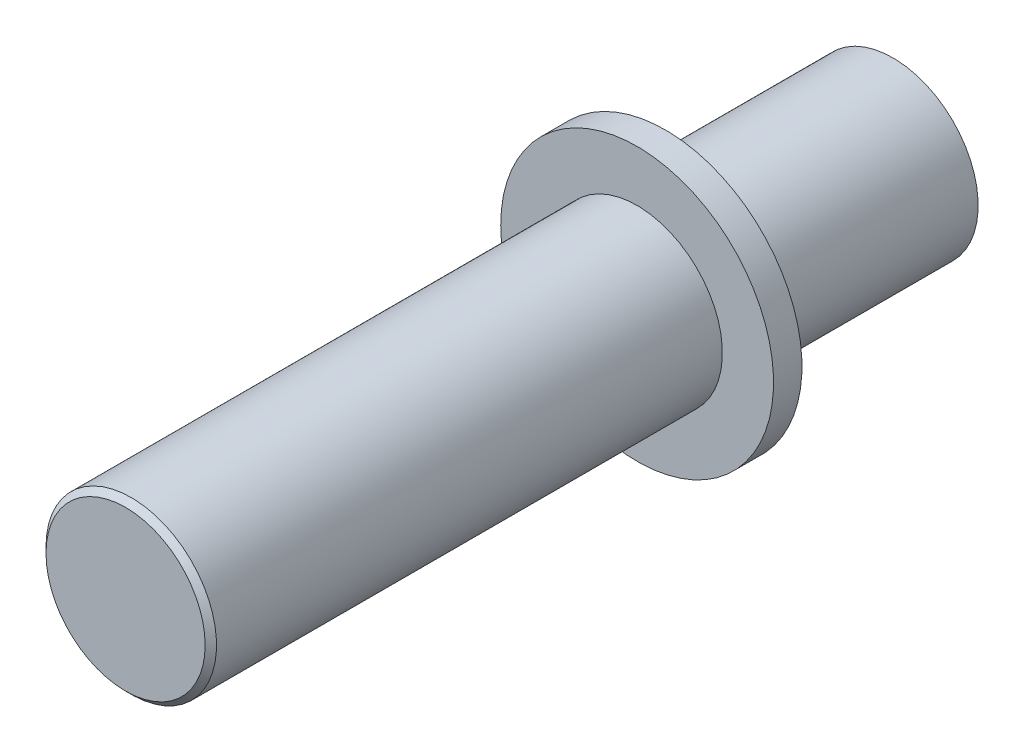
ISO-10303-21;
HEADER;
FILE_DESCRIPTION(('STEP AP214'),'2;1');
FILE_NAME('part.step','',(''),(''),'','','');
FILE_SCHEMA(('AUTOMOTIVE_DESIGN { 1 0 10303 214 1 1 1 1 }'));
ENDSEC;
DATA;
#1=APPLICATION_CONTEXT('core data for automotive mechanical design processes');
#2=APPLICATION_PROTOCOL_DEFINITION('international standard','automotive_design',2000,#1);
#3=PRODUCT_CONTEXT('',#1,'mechanical');
#4=PRODUCT('Part','Part','',(#3));
#5=PRODUCT_RELATED_PRODUCT_CATEGORY('part','',(#4));
#6=PRODUCT_DEFINITION_FORMATION('','',#4);
#7=PRODUCT_DEFINITION_CONTEXT('part definition',#1,'design');
#8=PRODUCT_DEFINITION('design','',#6,#7);
#9=PRODUCT_DEFINITION_SHAPE('','',#8);
#10=(LENGTH_UNIT() NAMED_UNIT(*) SI_UNIT(.MILLI.,.METRE.));
#11=(NAMED_UNIT(*) PLANE_ANGLE_UNIT() SI_UNIT($,.RADIAN.));
#12=(NAMED_UNIT(*) SI_UNIT($,.STERADIAN.) SOLID_ANGLE_UNIT());
#13=UNCERTAINTY_MEASURE_WITH_UNIT(LENGTH_MEASURE(1.E-05),#10,'distance_accuracy_value','');
#14=(GEOMETRIC_REPRESENTATION_CONTEXT(3) GLOBAL_UNCERTAINTY_ASSIGNED_CONTEXT((#13)) GLOBAL_UNIT_ASSIGNED_CONTEXT((#10,
#11,#12)) REPRESENTATION_CONTEXT('',''));
#15=CARTESIAN_POINT('',(0.,0.,0.));
#16=DIRECTION('',(0.,0.,1.));
#17=DIRECTION('',(1.,0.,0.));
#18=AXIS2_PLACEMENT_3D('',#15,#16,#17);
#19=CARTESIAN_POINT('',(0.,0.,-45.));
#20=DIRECTION('',(0.,0.,1.));
#21=DIRECTION('',(1.,0.,0.));
#22=AXIS2_PLACEMENT_3D('',#19,#20,#21);
#23=CYLINDRICAL_SURFACE('',#22,15.);
#24=CARTESIAN_POINT('',(0.,0.,-45.));
#25=DIRECTION('',(0.,0.,-1.));
#26=DIRECTION('',(-1.,0.,0.));
#27=AXIS2_PLACEMENT_3D('',#24,#25,#26);
#28=CIRCLE('',#27,15.);
#29=CARTESIAN_POINT('',(-15.,0.,-45.));
#30=VERTEX_POINT('',#29);
#31=EDGE_CURVE('E100',#30,#30,#28,.T.);
#32=ORIENTED_EDGE('',*,*,#31,.F.);
#33=EDGE_LOOP('',(#32));
#34=FACE_BOUND('',#33,.T.);
#35=CARTESIAN_POINT('',(0.,0.,-5.));
#36=DIRECTION('',(0.,0.,-1.));
#37=DIRECTION('',(-1.,0.,0.));
#38=AXIS2_PLACEMENT_3D('',#35,#36,#37);
#39=CIRCLE('',#38,15.);
#40=CARTESIAN_POINT('',(-15.,0.,-5.));
#41=VERTEX_POINT('',#40);
#42=EDGE_CURVE('E110',#41,#41,#39,.T.);
#43=ORIENTED_EDGE('',*,*,#42,.T.);
#44=EDGE_LOOP('',(#43));
#45=FACE_BOUND('',#44,.T.);
#46=CARTESIAN_POINT('',(-14.6360761339532,3.28409430454217,-35.));
#47=CARTESIAN_POINT('',(-14.6360673904646,3.28410443788733,-35.0911848866263));
#48=CARTESIAN_POINT('',(-14.6369280838113,3.28029672768275,-35.1823640275778));
#49=CARTESIAN_POINT('',(-14.640323565572,3.26512425746094,-35.3640476639354));
#50=CARTESIAN_POINT('',(-14.6428581208598,3.25376054979913,-35.4545522515147));
#51=CARTESIAN_POINT('',(-14.6495309686287,3.22358006749301,-35.6340983594927));
#52=CARTESIAN_POINT('',(-14.6536665582744,3.20477585259419,-35.7231420834127));
#53=CARTESIAN_POINT('',(-14.6634122187392,3.15988376018571,-35.8992665020335));
#54=CARTESIAN_POINT('',(-14.6690223005368,3.13379582844376,-35.9863471821128));
#55=CARTESIAN_POINT('',(-14.687833737922,3.04487505940193,-36.2437388248148));
#56=CARTESIAN_POINT('',(-14.7030224865645,2.97135888635153,-36.4103549303564));
#57=CARTESIAN_POINT('',(-14.7369739798396,2.79809585751142,-36.7288318405232));
#58=CARTESIAN_POINT('',(-14.7557373033109,2.69834475244518,-36.8806902493798));
#59=CARTESIAN_POINT('',(-14.7950769614794,2.47363535766516,-37.1679799141243));
#60=CARTESIAN_POINT('',(-14.8156763571002,2.34831984809302,-37.3031291235612));
#61=CARTESIAN_POINT('',(-14.8561666886425,2.07680503822484,-37.5506705580281));
#62=CARTESIAN_POINT('',(-14.8760575133632,1.93060247785895,-37.6630592239392));
#63=CARTESIAN_POINT('',(-14.9131408855729,1.61956098636061,-37.86301031204));
#64=CARTESIAN_POINT('',(-14.9303028364004,1.45454213367901,-37.9502990415209));
#65=CARTESIAN_POINT('',(-14.9597314968341,1.11174849351671,-38.0957950715919));
#66=CARTESIAN_POINT('',(-14.9719990142611,0.933975816759465,-38.1540071716468));
#67=CARTESIAN_POINT('',(-14.9900938120844,0.573672014912627,-38.2388097500845));
#68=CARTESIAN_POINT('',(-14.9960190906961,0.391259263531423,-38.2658818979296));
#69=CARTESIAN_POINT('',(-15.0011014049587,0.0243871876811102,-38.2891421015281));
#70=CARTESIAN_POINT('',(-15.0002590617395,-0.160071947419936,-38.285332991551));
#71=CARTESIAN_POINT('',(-14.9919756638605,-0.522471164563001,-38.2472963455022));
#72=CARTESIAN_POINT('',(-14.9846474030464,-0.70046877513565,-38.2135887396401));
#73=CARTESIAN_POINT('',(-14.9643442240964,-1.04821659454295,-38.1175407869745));
#74=CARTESIAN_POINT('',(-14.951369094969,-1.21796649494374,-38.0551993702823));
#75=CARTESIAN_POINT('',(-14.9210485548028,-1.5458471061543,-37.9031928452157));
#76=CARTESIAN_POINT('',(-14.9036717302401,-1.70388326958028,-37.8133303204009));
#77=CARTESIAN_POINT('',(-14.8664537139728,-2.00281756232733,-37.6089819676343));
#78=CARTESIAN_POINT('',(-14.8466122575426,-2.14371384743493,-37.4944934936464));
#79=CARTESIAN_POINT('',(-14.8061601595024,-2.40745048035647,-37.241329442382));
#80=CARTESIAN_POINT('',(-14.7855420995512,-2.52985582872668,-37.1022015421998));
#81=CARTESIAN_POINT('',(-14.7462406019416,-2.74970954136838,-36.8051365676289));
#82=CARTESIAN_POINT('',(-14.7275576954013,-2.84715106487696,-36.6471943549425));
#83=CARTESIAN_POINT('',(-14.6942188319452,-3.01450964465535,-36.316255642316));
#84=CARTESIAN_POINT('',(-14.6795772800056,-3.08432861679013,-36.1432081128627));
#85=CARTESIAN_POINT('',(-14.656181095365,-3.19367109446589,-35.787548607025));
#86=CARTESIAN_POINT('',(-14.647417697977,-3.23323971749128,-35.6049513101588));
#87=CARTESIAN_POINT('',(-14.6401092048503,-3.26607627377176,-35.3507079380317));
#88=CARTESIAN_POINT('',(-14.6385986898382,-3.27283499935054,-35.2806850051504));
#89=CARTESIAN_POINT('',(-14.6365828625324,-3.28183853881693,-35.1404521089196));
#90=CARTESIAN_POINT('',(-14.6360758814899,-3.28409084636923,-35.07024265079));
#91=CARTESIAN_POINT('',(-14.6360761339532,-3.28409430454216,-35.));
#92=B_SPLINE_CURVE_WITH_KNOTS('',3,(#46,#47,#48,#49,#50,#51,#52,#53,#54,#55,#56,#57,#58,#59,#60,
#61,#62,#63,#64,#65,#66,#67,#68,#69,#70,#71,#72,#73,#74,#75,#76,#77,#78,#79,#80,#81,#82,#83,#84,
#85,#86,#87,#88,#89,#90,#91),.UNSPECIFIED.,.F.,.F.,(4,2,2,2,2,2,2,2,2,2,2,2,2,2,2,2,2,2,2,2,2,2,
4),(0.,0.273461139868286,0.546884201633372,0.819847674680657,1.09281318018346,1.63827650777448,
2.18382823862361,2.73760147215752,3.29146123374236,3.85114928099916,4.41074491412399,
4.96156318415391,5.51233090087229,6.05370462538838,6.59509857972173,7.14047086003542,
7.68590176940924,8.24264293277179,8.79953649547502,9.3583901393562,9.9164086349329,
10.1273836700304,10.3380075849004),.UNSPECIFIED.);
#93=CARTESIAN_POINT('',(-14.6360761339532,3.28409430454217,-35.));
#94=VERTEX_POINT('',#93);
#95=CARTESIAN_POINT('',(-14.6360761339532,-3.28409430454217,-35.));
#96=VERTEX_POINT('',#95);
#97=EDGE_CURVE('E113',#94,#96,#92,.T.);
#98=ORIENTED_EDGE('',*,*,#97,.F.);
#99=DIRECTION('',(0.,0.,1.));
#100=VECTOR('',#99,1.);
#101=CARTESIAN_POINT('',(-14.6360761339532,3.28409430454217,-45.));
#102=LINE('',#101,#100);
#103=CARTESIAN_POINT('',(-14.6360761339532,3.28409430454216,-9.99999999999999));
#104=VERTEX_POINT('',#103);
#105=EDGE_CURVE('E11',#104,#94,#102,.F.);
#106=ORIENTED_EDGE('',*,*,#105,.F.);
#107=CARTESIAN_POINT('',(-14.6360761339532,-3.28409430454217,-9.99999999999999));
#108=CARTESIAN_POINT('',(-14.6360673904646,-3.28410443788733,-9.90881511337366));
#109=CARTESIAN_POINT('',(-14.6369280838113,-3.28029672768275,-9.81763597242218));
#110=CARTESIAN_POINT('',(-14.640323565572,-3.26512425746094,-9.63595233606456));
#111=CARTESIAN_POINT('',(-14.6428581208598,-3.25376054979913,-9.54544774848526));
#112=CARTESIAN_POINT('',(-14.6495309686287,-3.22358006749302,-9.36590164050732));
#113=CARTESIAN_POINT('',(-14.6536665582744,-3.20477585259419,-9.27685791658731));
#114=CARTESIAN_POINT('',(-14.6634122187392,-3.15988376018571,-9.10073349796651));
#115=CARTESIAN_POINT('',(-14.6690223005368,-3.13379582844376,-9.01365281788715));
#116=CARTESIAN_POINT('',(-14.687833737922,-3.04487505940193,-8.75626117518519));
#117=CARTESIAN_POINT('',(-14.7030224865645,-2.97135888635154,-8.58964506964361));
#118=CARTESIAN_POINT('',(-14.7369739798396,-2.79809585751143,-8.27116815947684));
#119=CARTESIAN_POINT('',(-14.7557373033109,-2.69834475244518,-8.11930975062018));
#120=CARTESIAN_POINT('',(-14.7950769614794,-2.47363535766516,-7.8320200858757));
#121=CARTESIAN_POINT('',(-14.8156763571002,-2.34831984809302,-7.69687087643878));
#122=CARTESIAN_POINT('',(-14.8561666886425,-2.07680503822484,-7.44932944197191));
#123=CARTESIAN_POINT('',(-14.8760575133632,-1.93060247785895,-7.33694077606079));
#124=CARTESIAN_POINT('',(-14.9131408855729,-1.61956098636061,-7.13698968796));
#125=CARTESIAN_POINT('',(-14.9303028364004,-1.45454213367901,-7.04970095847909));
#126=CARTESIAN_POINT('',(-14.9597314968341,-1.11174849351671,-6.90420492840806));
#127=CARTESIAN_POINT('',(-14.9719990142611,-0.933975816759464,-6.8459928283532));
#128=CARTESIAN_POINT('',(-14.9900938120844,-0.573672014912626,-6.76119024991547));
#129=CARTESIAN_POINT('',(-14.9960190906961,-0.391259263531423,-6.73411810207034));
#130=CARTESIAN_POINT('',(-15.0011014049587,-0.0243871876811108,-6.71085789847192));
#131=CARTESIAN_POINT('',(-15.0002590617395,0.160071947419934,-6.71466700844895));
#132=CARTESIAN_POINT('',(-14.9919756638605,0.522471164562999,-6.75270365449784));
#133=CARTESIAN_POINT('',(-14.9846474030464,0.700468775135649,-6.78641126035994));
#134=CARTESIAN_POINT('',(-14.9643442240964,1.04821659454295,-6.88245921302551));
#135=CARTESIAN_POINT('',(-14.951369094969,1.21796649494374,-6.94480062971769));
#136=CARTESIAN_POINT('',(-14.9210485548028,1.5458471061543,-7.09680715478427));
#137=CARTESIAN_POINT('',(-14.9036717302401,1.70388326958028,-7.18666967959913));
#138=CARTESIAN_POINT('',(-14.8664537139728,2.00281756232733,-7.39101803236573));
#139=CARTESIAN_POINT('',(-14.8466122575426,2.14371384743493,-7.50550650635355));
#140=CARTESIAN_POINT('',(-14.8061601595024,2.40745048035647,-7.75867055761803));
#141=CARTESIAN_POINT('',(-14.7855420995512,2.52985582872668,-7.89779845780017));
#142=CARTESIAN_POINT('',(-14.7462406019416,2.74970954136838,-8.19486343237114));
#143=CARTESIAN_POINT('',(-14.7275576954013,2.84715106487696,-8.35280564505752));
#144=CARTESIAN_POINT('',(-14.6942188319452,3.01450964465535,-8.68374435768398));
#145=CARTESIAN_POINT('',(-14.6795772800056,3.08432861679013,-8.85679188713728));
#146=CARTESIAN_POINT('',(-14.656181095365,3.19367109446588,-9.21245139297496));
#147=CARTESIAN_POINT('',(-14.647417697977,3.23323971749128,-9.39504868984123));
#148=CARTESIAN_POINT('',(-14.6401092048503,3.26607627377176,-9.64929206196834));
#149=CARTESIAN_POINT('',(-14.6385986898382,3.27283499935053,-9.71931499484959));
#150=CARTESIAN_POINT('',(-14.6365828625324,3.28183853881693,-9.85954789108042));
#151=CARTESIAN_POINT('',(-14.6360758814899,3.28409084636923,-9.92975734921005));
#152=CARTESIAN_POINT('',(-14.6360761339532,3.28409430454216,-9.99999999999999));
#153=B_SPLINE_CURVE_WITH_KNOTS('',3,(#107,#108,#109,#110,#111,#112,#113,#114,#115,#116,#117,
#118,#119,#120,#121,#122,#123,#124,#125,#126,#127,#128,#129,#130,#131,#132,#133,#134,#135,#136,
#137,#138,#139,#140,#141,#142,#143,#144,#145,#146,#147,#148,#149,#150,#151,#152),.UNSPECIFIED.,
.F.,.F.,(4,2,2,2,2,2,2,2,2,2,2,2,2,2,2,2,2,2,2,2,2,2,4),(0.,0.273461139868287,0.546884201633376,
0.819847674680651,1.09281318018346,1.63827650777447,2.18382823862362,2.73760147215752,
3.29146123374236,3.85114928099916,4.41074491412399,4.96156318415391,5.51233090087229,
6.05370462538838,6.59509857972173,7.14047086003542,7.68590176940924,8.2426429327718,
8.79953649547502,9.3583901393562,9.91640863493291,10.1273836700304,10.3380075849004),.UNSPECIFIED.);
#154=CARTESIAN_POINT('',(-14.6360761339532,-3.28409430454217,-9.99999999999999));
#155=VERTEX_POINT('',#154);
#156=EDGE_CURVE('E48',#155,#104,#153,.T.);
#157=ORIENTED_EDGE('',*,*,#156,.F.);
#158=DIRECTION('',(0.,0.,1.));
#159=VECTOR('',#158,1.);
#160=CARTESIAN_POINT('',(-14.6360761339532,-3.28409430454216,-45.));
#161=LINE('',#160,#159);
#162=EDGE_CURVE('E99',#96,#155,#161,.T.);
#163=ORIENTED_EDGE('',*,*,#162,.F.);
#164=EDGE_LOOP('',(#98,#106,#157,#163));
#165=FACE_BOUND('',#164,.T.);
#166=ADVANCED_FACE('F39',(#34,#45,#165),#23,.T.);
#167=CARTESIAN_POINT('',(0.,0.,90.));
#168=DIRECTION('',(0.,0.,-1.));
#169=DIRECTION('',(-1.,0.,0.));
#170=AXIS2_PLACEMENT_3D('',#167,#168,#169);
#171=CYLINDRICAL_SURFACE('',#170,15.);
#172=CARTESIAN_POINT('',(0.,0.,89.0000000000001));
#173=DIRECTION('',(0.,0.,1.));
#174=DIRECTION('',(1.,0.,0.));
#175=AXIS2_PLACEMENT_3D('',#172,#173,#174);
#176=CIRCLE('',#175,15.);
#177=CARTESIAN_POINT('',(-15.,0.,89.0000000000001));
#178=VERTEX_POINT('',#177);
#179=EDGE_CURVE('E114',#178,#178,#176,.F.);
#180=CARTESIAN_POINT('',(0.,0.,0.));
#181=DIRECTION('',(0.,0.,1.));
#182=DIRECTION('',(1.,0.,0.));
#183=AXIS2_PLACEMENT_3D('',#180,#181,#182);
#184=CIRCLE('',#183,15.);
#185=CARTESIAN_POINT('',(-15.,0.,0.));
#186=VERTEX_POINT('',#185);
#187=EDGE_CURVE('E118',#186,#186,#184,.T.);
#188=CARTESIAN_POINT('',(-15.,0.,89.0000000000001));
#189=CARTESIAN_POINT('',(-15.,0.,88.0729166666667));
#190=CARTESIAN_POINT('',(-15.,0.,87.1458333333334));
#191=CARTESIAN_POINT('',(-15.,0.,85.2916666666667));
#192=CARTESIAN_POINT('',(-15.,0.,84.3645833333334));
#193=CARTESIAN_POINT('',(-15.,0.,82.5104166666667));
#194=CARTESIAN_POINT('',(-15.,0.,81.5833333333334));
#195=CARTESIAN_POINT('',(-15.,0.,79.7291666666667));
#196=CARTESIAN_POINT('',(-15.,0.,78.8020833333334));
#197=CARTESIAN_POINT('',(-15.,0.,76.9479166666667));
#198=CARTESIAN_POINT('',(-15.,0.,76.0208333333334));
#199=CARTESIAN_POINT('',(-15.,0.,74.1666666666667));
#200=CARTESIAN_POINT('',(-15.,0.,73.2395833333334));
#201=CARTESIAN_POINT('',(-15.,0.,71.3854166666667));
#202=CARTESIAN_POINT('',(-15.,0.,70.4583333333334));
#203=CARTESIAN_POINT('',(-15.,0.,68.6041666666667));
#204=CARTESIAN_POINT('',(-15.,0.,67.6770833333334));
#205=CARTESIAN_POINT('',(-15.,0.,65.8229166666667));
#206=CARTESIAN_POINT('',(-15.,0.,64.8958333333334));
#207=CARTESIAN_POINT('',(-15.,0.,63.0416666666667));
#208=CARTESIAN_POINT('',(-15.,0.,62.1145833333334));
#209=CARTESIAN_POINT('',(-15.,0.,60.2604166666667));
#210=CARTESIAN_POINT('',(-15.,0.,59.3333333333334));
#211=CARTESIAN_POINT('',(-15.,0.,57.4791666666667));
#212=CARTESIAN_POINT('',(-15.,0.,56.5520833333334));
#213=CARTESIAN_POINT('',(-15.,0.,54.6979166666667));
#214=CARTESIAN_POINT('',(-15.,0.,53.7708333333334));
#215=CARTESIAN_POINT('',(-15.,0.,51.9166666666667));
#216=CARTESIAN_POINT('',(-15.,0.,50.9895833333334));
#217=CARTESIAN_POINT('',(-15.,0.,49.1354166666667));
#218=CARTESIAN_POINT('',(-15.,0.,48.2083333333334));
#219=CARTESIAN_POINT('',(-15.,0.,46.3541666666667));
#220=CARTESIAN_POINT('',(-15.,0.,45.4270833333334));
#221=CARTESIAN_POINT('',(-15.,0.,43.5729166666667));
#222=CARTESIAN_POINT('',(-15.,0.,42.6458333333334));
#223=CARTESIAN_POINT('',(-15.,0.,40.7916666666667));
#224=CARTESIAN_POINT('',(-15.,0.,39.8645833333334));
#225=CARTESIAN_POINT('',(-15.,0.,38.0104166666667));
#226=CARTESIAN_POINT('',(-15.,0.,37.0833333333334));
#227=CARTESIAN_POINT('',(-15.,0.,35.2291666666667));
#228=CARTESIAN_POINT('',(-15.,0.,34.3020833333334));
#229=CARTESIAN_POINT('',(-15.,0.,32.4479166666667));
#230=CARTESIAN_POINT('',(-15.,0.,31.5208333333334));
#231=CARTESIAN_POINT('',(-15.,0.,29.6666666666667));
#232=CARTESIAN_POINT('',(-15.,0.,28.7395833333333));
#233=CARTESIAN_POINT('',(-15.,0.,26.8854166666667));
#234=CARTESIAN_POINT('',(-15.,0.,25.9583333333333));
#235=CARTESIAN_POINT('',(-15.,0.,24.1041666666667));
#236=CARTESIAN_POINT('',(-15.,0.,23.1770833333333));
#237=CARTESIAN_POINT('',(-15.,0.,21.3229166666667));
#238=CARTESIAN_POINT('',(-15.,0.,20.3958333333333));
#239=CARTESIAN_POINT('',(-15.,0.,18.5416666666667));
#240=CARTESIAN_POINT('',(-15.,0.,17.6145833333333));
#241=CARTESIAN_POINT('',(-15.,0.,15.7604166666667));
#242=CARTESIAN_POINT('',(-15.,0.,14.8333333333333));
#243=CARTESIAN_POINT('',(-15.,0.,12.9791666666667));
#244=CARTESIAN_POINT('',(-15.,0.,12.0520833333333));
#245=CARTESIAN_POINT('',(-15.,0.,10.1979166666667));
#246=CARTESIAN_POINT('',(-15.,0.,9.27083333333333));
#247=CARTESIAN_POINT('',(-15.,0.,7.41666666666666));
#248=CARTESIAN_POINT('',(-15.,0.,6.48958333333333));
#249=CARTESIAN_POINT('',(-15.,0.,4.63541666666666));
#250=CARTESIAN_POINT('',(-15.,0.,3.70833333333332));
#251=CARTESIAN_POINT('',(-15.,0.,1.85416666666665));
#252=CARTESIAN_POINT('',(-15.,0.,0.927083333333321));
#253=CARTESIAN_POINT('',(-15.,0.,0.));
#254=B_SPLINE_CURVE_WITH_KNOTS('',3,(#188,#189,#190,#191,#192,#193,#194,#195,#196,#197,#198,
#199,#200,#201,#202,#203,#204,#205,#206,#207,#208,#209,#210,#211,#212,#213,#214,#215,#216,#217,
#218,#219,#220,#221,#222,#223,#224,#225,#226,#227,#228,#229,#230,#231,#232,#233,#234,#235,#236,
#237,#238,#239,#240,#241,#242,#243,#244,#245,#246,#247,#248,#249,#250,#251,#252,#253),
.UNSPECIFIED.,.F.,.F.,(4,2,2,2,2,2,2,2,2,2,2,2,2,2,2,2,2,2,2,2,2,2,2,2,2,2,2,2,2,2,2,2,4),(0.,
2.78125,5.5625,8.34375,11.125,13.90625,16.6875,19.46875,22.25,25.03125,27.8125,30.59375,33.375,
36.15625,38.9375,41.71875,44.5,47.28125,50.0625,52.84375,55.625,58.40625,61.1875,63.96875,
66.7500000000001,69.5312500000001,72.3125000000001,75.0937500000001,77.8750000000001,
80.6562500000001,83.4375000000001,86.2187500000001,89.0000000000001),.UNSPECIFIED.);
#255=EDGE_CURVE('BSEAM182',#178,#186,#254,.T.);
#256=ORIENTED_EDGE('',*,*,#179,.T.);
#257=ORIENTED_EDGE('',*,*,#187,.T.);
#258=ORIENTED_EDGE('',*,*,#255,.T.);
#259=ORIENTED_EDGE('',*,*,#255,.F.);
#260=EDGE_LOOP('',(#256,#258,#257,#259));
#261=FACE_BOUND('',#260,.T.);
#262=ADVANCED_FACE('F182',(#261),#171,.T.);
#263=CARTESIAN_POINT('',(0.,0.,90.));
#264=DIRECTION('',(0.,0.,1.));
#265=DIRECTION('',(1.,0.,0.));
#266=AXIS2_PLACEMENT_3D('',#263,#264,#265);
#267=PLANE('',#266);
#268=CARTESIAN_POINT('',(0.,0.,90.));
#269=DIRECTION('',(0.,0.,1.));
#270=DIRECTION('',(1.,0.,0.));
#271=AXIS2_PLACEMENT_3D('',#268,#269,#270);
#272=CIRCLE('',#271,14.0000000000001);
#273=CARTESIAN_POINT('',(14.0000000000001,0.,90.));
#274=VERTEX_POINT('',#273);
#275=EDGE_CURVE('E123',#274,#274,#272,.T.);
#276=ORIENTED_EDGE('',*,*,#275,.T.);
#277=EDGE_LOOP('',(#276));
#278=FACE_BOUND('',#277,.T.);
#279=ADVANCED_FACE('F194',(#278),#267,.T.);
#280=CARTESIAN_POINT('',(0.,0.,-5.));
#281=DIRECTION('',(0.,0.,1.));
#282=DIRECTION('',(1.,0.,0.));
#283=AXIS2_PLACEMENT_3D('',#280,#281,#282);
#284=CYLINDRICAL_SURFACE('',#283,24.);
#285=CARTESIAN_POINT('',(0.,0.,-5.));
#286=DIRECTION('',(0.,0.,-1.));
#287=DIRECTION('',(-1.,0.,0.));
#288=AXIS2_PLACEMENT_3D('',#285,#286,#287);
#289=CIRCLE('',#288,24.);
#290=CARTESIAN_POINT('',(-24.,0.,-5.));
#291=VERTEX_POINT('',#290);
#292=EDGE_CURVE('E115',#291,#291,#289,.T.);
#293=ORIENTED_EDGE('',*,*,#292,.F.);
#294=EDGE_LOOP('',(#293));
#295=FACE_BOUND('',#294,.T.);
#296=CARTESIAN_POINT('',(0.,0.,0.));
#297=DIRECTION('',(0.,0.,-1.));
#298=DIRECTION('',(-1.,0.,0.));
#299=AXIS2_PLACEMENT_3D('',#296,#297,#298);
#300=CIRCLE('',#299,24.);
#301=CARTESIAN_POINT('',(-24.,0.,0.));
#302=VERTEX_POINT('',#301);
#303=EDGE_CURVE('E104',#302,#302,#300,.T.);
#304=ORIENTED_EDGE('',*,*,#303,.T.);
#305=EDGE_LOOP('',(#304));
#306=FACE_BOUND('',#305,.T.);
#307=ADVANCED_FACE('F189',(#295,#306),#284,.T.);
#308=CARTESIAN_POINT('',(0.,0.,-5.));
#309=DIRECTION('',(0.,0.,-1.));
#310=DIRECTION('',(-1.,0.,0.));
#311=AXIS2_PLACEMENT_3D('',#308,#309,#310);
#312=PLANE('',#311);
#313=ORIENTED_EDGE('',*,*,#42,.F.);
#314=EDGE_LOOP('',(#313));
#315=FACE_BOUND('',#314,.T.);
#316=ORIENTED_EDGE('',*,*,#292,.T.);
#317=EDGE_LOOP('',(#316));
#318=FACE_BOUND('',#317,.T.);
#319=ADVANCED_FACE('F185',(#315,#318),#312,.T.);
#320=CARTESIAN_POINT('',(0.,0.,0.));
#321=DIRECTION('',(0.,0.,-1.));
#322=DIRECTION('',(-1.,0.,0.));
#323=AXIS2_PLACEMENT_3D('',#320,#321,#322);
#324=PLANE('',#323);
#325=ORIENTED_EDGE('',*,*,#187,.F.);
#326=EDGE_LOOP('',(#325));
#327=FACE_BOUND('',#326,.T.);
#328=ORIENTED_EDGE('',*,*,#303,.F.);
#329=EDGE_LOOP('',(#328));
#330=FACE_BOUND('',#329,.T.);
#331=ADVANCED_FACE('F188',(#327,#330),#324,.F.);
#332=CARTESIAN_POINT('',(0.,0.,90.));
#333=DIRECTION('',(0.,0.,-1.));
#334=DIRECTION('',(-1.,0.,0.));
#335=AXIS2_PLACEMENT_3D('',#332,#333,#334);
#336=CONICAL_SURFACE('',#335,14.0000000000001,0.78539816339745);
#337=ORIENTED_EDGE('',*,*,#179,.F.);
#338=EDGE_LOOP('',(#337));
#339=FACE_BOUND('',#338,.T.);
#340=ORIENTED_EDGE('',*,*,#275,.F.);
#341=EDGE_LOOP('',(#340));
#342=FACE_BOUND('',#341,.T.);
#343=ADVANCED_FACE('F42',(#339,#342),#336,.T.);
#344=CARTESIAN_POINT('',(0.,0.,-45.));
#345=DIRECTION('',(0.,0.,-1.));
#346=DIRECTION('',(-1.,0.,0.));
#347=AXIS2_PLACEMENT_3D('',#344,#345,#346);
#348=PLANE('',#347);
#349=CARTESIAN_POINT('',(0.,0.,-45.));
#350=DIRECTION('',(0.,0.,-1.));
#351=DIRECTION('',(-1.,0.,0.));
#352=AXIS2_PLACEMENT_3D('',#349,#350,#351);
#353=CIRCLE('',#352,8.);
#354=CARTESIAN_POINT('',(-8.,0.,-45.));
#355=VERTEX_POINT('',#354);
#356=EDGE_CURVE('E162',#355,#355,#353,.T.);
#357=ORIENTED_EDGE('',*,*,#356,.F.);
#358=EDGE_LOOP('',(#357));
#359=FACE_BOUND('',#358,.T.);
#360=ORIENTED_EDGE('',*,*,#31,.T.);
#361=EDGE_LOOP('',(#360));
#362=FACE_BOUND('',#361,.T.);
#363=ADVANCED_FACE('F150',(#359,#362),#348,.T.);
#364=CARTESIAN_POINT('',(-13.,0.,-9.99999999999999));
#365=DIRECTION('',(-1.,0.,0.));
#366=DIRECTION('',(0.,-1.,0.));
#367=AXIS2_PLACEMENT_3D('',#364,#365,#366);
#368=CYLINDRICAL_SURFACE('',#367,3.28409430454217);
#369=DIRECTION('',(-1.,0.,0.));
#370=VECTOR('',#369,1.);
#371=CARTESIAN_POINT('',(-13.,-3.28409430454217,-9.99999999999999));
#372=LINE('',#371,#370);
#373=CARTESIAN_POINT('',(-13.,-3.28409430454217,-9.99999999999999));
#374=VERTEX_POINT('',#373);
#375=EDGE_CURVE('E95',#374,#155,#372,.T.);
#376=ORIENTED_EDGE('',*,*,#375,.T.);
#377=ORIENTED_EDGE('',*,*,#156,.T.);
#378=DIRECTION('',(-1.,0.,0.));
#379=VECTOR('',#378,1.);
#380=CARTESIAN_POINT('',(-13.,3.28409430454216,-9.99999999999999));
#381=LINE('',#380,#379);
#382=CARTESIAN_POINT('',(-13.,3.28409430454216,-9.99999999999999));
#383=VERTEX_POINT('',#382);
#384=EDGE_CURVE('E54',#383,#104,#381,.T.);
#385=ORIENTED_EDGE('',*,*,#384,.F.);
#386=CARTESIAN_POINT('',(-13.,0.,-9.99999999999999));
#387=DIRECTION('',(1.,0.,0.));
#388=DIRECTION('',(0.,1.,0.));
#389=AXIS2_PLACEMENT_3D('',#386,#387,#388);
#390=CIRCLE('',#389,3.28409430454217);
#391=EDGE_CURVE('E85',#383,#374,#390,.T.);
#392=ORIENTED_EDGE('',*,*,#391,.T.);
#393=EDGE_LOOP('',(#376,#377,#385,#392));
#394=FACE_BOUND('',#393,.T.);
#395=ADVANCED_FACE('F94',(#394),#368,.F.);
#396=CARTESIAN_POINT('',(-13.,-3.28409430454217,-9.99999999999999));
#397=DIRECTION('',(0.,1.,0.));
#398=DIRECTION('',(0.,0.,1.));
#399=AXIS2_PLACEMENT_3D('',#396,#397,#398);
#400=PLANE('',#399);
#401=ORIENTED_EDGE('',*,*,#162,.T.);
#402=ORIENTED_EDGE('',*,*,#375,.F.);
#403=DIRECTION('',(0.,0.,-1.));
#404=VECTOR('',#403,1.);
#405=CARTESIAN_POINT('',(-13.,-3.28409430454217,-9.99999999999999));
#406=LINE('',#405,#404);
#407=CARTESIAN_POINT('',(-13.,-3.28409430454217,-35.));
#408=VERTEX_POINT('',#407);
#409=EDGE_CURVE('E81',#374,#408,#406,.T.);
#410=ORIENTED_EDGE('',*,*,#409,.T.);
#411=DIRECTION('',(-1.,0.,0.));
#412=VECTOR('',#411,1.);
#413=CARTESIAN_POINT('',(-13.,-3.28409430454217,-35.));
#414=LINE('',#413,#412);
#415=EDGE_CURVE('E101',#408,#96,#414,.T.);
#416=ORIENTED_EDGE('',*,*,#415,.T.);
#417=EDGE_LOOP('',(#401,#402,#410,#416));
#418=FACE_BOUND('',#417,.T.);
#419=ADVANCED_FACE('F98',(#418),#400,.T.);
#420=CARTESIAN_POINT('',(-13.,0.,-35.));
#421=DIRECTION('',(-1.,0.,0.));
#422=DIRECTION('',(0.,-1.,0.));
#423=AXIS2_PLACEMENT_3D('',#420,#421,#422);
#424=CYLINDRICAL_SURFACE('',#423,3.28409430454217);
#425=DIRECTION('',(-1.,0.,0.));
#426=VECTOR('',#425,1.);
#427=CARTESIAN_POINT('',(-13.,3.28409430454217,-35.));
#428=LINE('',#427,#426);
#429=CARTESIAN_POINT('',(-13.,3.28409430454217,-35.));
#430=VERTEX_POINT('',#429);
#431=EDGE_CURVE('E106',#430,#94,#428,.T.);
#432=ORIENTED_EDGE('',*,*,#431,.T.);
#433=ORIENTED_EDGE('',*,*,#97,.T.);
#434=ORIENTED_EDGE('',*,*,#415,.F.);
#435=CARTESIAN_POINT('',(-13.,0.,-35.));
#436=DIRECTION('',(1.,0.,0.));
#437=DIRECTION('',(0.,1.,0.));
#438=AXIS2_PLACEMENT_3D('',#435,#436,#437);
#439=CIRCLE('',#438,3.28409430454217);
#440=EDGE_CURVE('E86',#408,#430,#439,.T.);
#441=ORIENTED_EDGE('',*,*,#440,.T.);
#442=EDGE_LOOP('',(#432,#433,#434,#441));
#443=FACE_BOUND('',#442,.T.);
#444=ADVANCED_FACE('F138',(#443),#424,.F.);
#445=CARTESIAN_POINT('',(-13.,3.28409430454216,-9.99999999999999));
#446=DIRECTION('',(0.,-1.,0.));
#447=DIRECTION('',(0.,0.,-1.));
#448=AXIS2_PLACEMENT_3D('',#445,#446,#447);
#449=PLANE('',#448);
#450=ORIENTED_EDGE('',*,*,#105,.T.);
#451=ORIENTED_EDGE('',*,*,#431,.F.);
#452=DIRECTION('',(0.,0.,1.));
#453=VECTOR('',#452,1.);
#454=CARTESIAN_POINT('',(-13.,3.28409430454216,-9.99999999999999));
#455=LINE('',#454,#453);
#456=EDGE_CURVE('E157',#430,#383,#455,.T.);
#457=ORIENTED_EDGE('',*,*,#456,.T.);
#458=ORIENTED_EDGE('',*,*,#384,.T.);
#459=EDGE_LOOP('',(#450,#451,#457,#458));
#460=FACE_BOUND('',#459,.T.);
#461=ADVANCED_FACE('F143',(#460),#449,.T.);
#462=CARTESIAN_POINT('',(-13.,0.,-9.99999999999999));
#463=DIRECTION('',(1.,0.,0.));
#464=DIRECTION('',(0.,1.,0.));
#465=AXIS2_PLACEMENT_3D('',#462,#463,#464);
#466=PLANE('',#465);
#467=ORIENTED_EDGE('',*,*,#391,.F.);
#468=ORIENTED_EDGE('',*,*,#456,.F.);
#469=ORIENTED_EDGE('',*,*,#440,.F.);
#470=ORIENTED_EDGE('',*,*,#409,.F.);
#471=EDGE_LOOP('',(#467,#468,#469,#470));
#472=FACE_BOUND('',#471,.T.);
#473=ADVANCED_FACE('F83',(#472),#466,.F.);
#474=CARTESIAN_POINT('',(0.,0.,0.));
#475=DIRECTION('',(0.,0.,-1.));
#476=DIRECTION('',(-1.,0.,0.));
#477=AXIS2_PLACEMENT_3D('',#474,#475,#476);
#478=CYLINDRICAL_SURFACE('',#477,8.);
#479=CARTESIAN_POINT('',(0.,0.,0.));
#480=DIRECTION('',(0.,0.,-1.));
#481=DIRECTION('',(-1.,0.,0.));
#482=AXIS2_PLACEMENT_3D('',#479,#480,#481);
#483=CIRCLE('',#482,8.);
#484=CARTESIAN_POINT('',(-8.,0.,0.));
#485=VERTEX_POINT('',#484);
#486=EDGE_CURVE('E96',#485,#485,#483,.T.);
#487=CARTESIAN_POINT('',(-8.,0.,0.));
#488=CARTESIAN_POINT('',(-8.,0.,-0.468749999999999));
#489=CARTESIAN_POINT('',(-8.,0.,-0.9375));
#490=CARTESIAN_POINT('',(-8.,0.,-1.875));
#491=CARTESIAN_POINT('',(-8.,0.,-2.34375));
#492=CARTESIAN_POINT('',(-8.,0.,-3.28125));
#493=CARTESIAN_POINT('',(-8.,0.,-3.75));
#494=CARTESIAN_POINT('',(-8.,0.,-4.6875));
#495=CARTESIAN_POINT('',(-8.,0.,-5.15625));
#496=CARTESIAN_POINT('',(-8.,0.,-6.09375));
#497=CARTESIAN_POINT('',(-8.,0.,-6.5625));
#498=CARTESIAN_POINT('',(-8.,0.,-7.5));
#499=CARTESIAN_POINT('',(-8.,0.,-7.96875));
#500=CARTESIAN_POINT('',(-8.,0.,-8.90625));
#501=CARTESIAN_POINT('',(-8.,0.,-9.375));
#502=CARTESIAN_POINT('',(-8.,0.,-10.3125));
#503=CARTESIAN_POINT('',(-8.,0.,-10.78125));
#504=CARTESIAN_POINT('',(-8.,0.,-11.71875));
#505=CARTESIAN_POINT('',(-8.,0.,-12.1875));
#506=CARTESIAN_POINT('',(-8.,0.,-13.125));
#507=CARTESIAN_POINT('',(-8.,0.,-13.59375));
#508=CARTESIAN_POINT('',(-8.,0.,-14.53125));
#509=CARTESIAN_POINT('',(-8.,0.,-15.));
#510=CARTESIAN_POINT('',(-8.,0.,-15.9375));
#511=CARTESIAN_POINT('',(-8.,0.,-16.40625));
#512=CARTESIAN_POINT('',(-8.,0.,-17.34375));
#513=CARTESIAN_POINT('',(-8.,0.,-17.8125));
#514=CARTESIAN_POINT('',(-8.,0.,-18.75));
#515=CARTESIAN_POINT('',(-8.,0.,-19.21875));
#516=CARTESIAN_POINT('',(-8.,0.,-20.15625));
#517=CARTESIAN_POINT('',(-8.,0.,-20.625));
#518=CARTESIAN_POINT('',(-8.,0.,-21.5625));
#519=CARTESIAN_POINT('',(-8.,0.,-22.03125));
#520=CARTESIAN_POINT('',(-8.,0.,-22.96875));
#521=CARTESIAN_POINT('',(-8.,0.,-23.4375));
#522=CARTESIAN_POINT('',(-8.,0.,-24.375));
#523=CARTESIAN_POINT('',(-8.,0.,-24.84375));
#524=CARTESIAN_POINT('',(-8.,0.,-25.78125));
#525=CARTESIAN_POINT('',(-8.,0.,-26.25));
#526=CARTESIAN_POINT('',(-8.,0.,-27.1875));
#527=CARTESIAN_POINT('',(-8.,0.,-27.65625));
#528=CARTESIAN_POINT('',(-8.,0.,-28.59375));
#529=CARTESIAN_POINT('',(-8.,0.,-29.0625));
#530=CARTESIAN_POINT('',(-8.,0.,-30.));
#531=CARTESIAN_POINT('',(-8.,0.,-30.46875));
#532=CARTESIAN_POINT('',(-8.,0.,-31.40625));
#533=CARTESIAN_POINT('',(-8.,0.,-31.875));
#534=CARTESIAN_POINT('',(-8.,0.,-32.8125));
#535=CARTESIAN_POINT('',(-8.,0.,-33.28125));
#536=CARTESIAN_POINT('',(-8.,0.,-34.21875));
#537=CARTESIAN_POINT('',(-8.,0.,-34.6875));
#538=CARTESIAN_POINT('',(-8.,0.,-35.625));
#539=CARTESIAN_POINT('',(-8.,0.,-36.09375));
#540=CARTESIAN_POINT('',(-8.,0.,-37.03125));
#541=CARTESIAN_POINT('',(-8.,0.,-37.5));
#542=CARTESIAN_POINT('',(-8.,0.,-38.4375));
#543=CARTESIAN_POINT('',(-8.,0.,-38.90625));
#544=CARTESIAN_POINT('',(-8.,0.,-39.84375));
#545=CARTESIAN_POINT('',(-8.,0.,-40.3125));
#546=CARTESIAN_POINT('',(-8.,0.,-41.25));
#547=CARTESIAN_POINT('',(-8.,0.,-41.71875));
#548=CARTESIAN_POINT('',(-8.,0.,-42.65625));
#549=CARTESIAN_POINT('',(-8.,0.,-43.125));
#550=CARTESIAN_POINT('',(-8.,0.,-44.0625));
#551=CARTESIAN_POINT('',(-8.,0.,-44.53125));
#552=CARTESIAN_POINT('',(-8.,0.,-45.));
#553=B_SPLINE_CURVE_WITH_KNOTS('',3,(#487,#488,#489,#490,#491,#492,#493,#494,#495,#496,#497,
#498,#499,#500,#501,#502,#503,#504,#505,#506,#507,#508,#509,#510,#511,#512,#513,#514,#515,#516,
#517,#518,#519,#520,#521,#522,#523,#524,#525,#526,#527,#528,#529,#530,#531,#532,#533,#534,#535,
#536,#537,#538,#539,#540,#541,#542,#543,#544,#545,#546,#547,#548,#549,#550,#551,#552),
.UNSPECIFIED.,.F.,.F.,(4,2,2,2,2,2,2,2,2,2,2,2,2,2,2,2,2,2,2,2,2,2,2,2,2,2,2,2,2,2,2,2,4),(0.,
1.40625,2.8125,4.21875,5.625,7.03125,8.4375,9.84375,11.25,12.65625,14.0625,15.46875,16.875,
18.28125,19.6875,21.09375,22.5,23.90625,25.3125,26.71875,28.125,29.53125,30.9375,32.34375,33.75,
35.15625,36.5625,37.96875,39.375,40.78125,42.1875,43.59375,45.),.UNSPECIFIED.);
#554=EDGE_CURVE('BSEAM170',#485,#355,#553,.T.);
#555=ORIENTED_EDGE('',*,*,#486,.F.);
#556=ORIENTED_EDGE('',*,*,#356,.T.);
#557=ORIENTED_EDGE('',*,*,#554,.T.);
#558=ORIENTED_EDGE('',*,*,#554,.F.);
#559=EDGE_LOOP('',(#555,#557,#556,#558));
#560=FACE_BOUND('',#559,.T.);
#561=ADVANCED_FACE('F170',(#560),#478,.F.);
#562=CARTESIAN_POINT('',(0.,0.,0.));
#563=DIRECTION('',(0.,0.,-1.));
#564=DIRECTION('',(-1.,0.,0.));
#565=AXIS2_PLACEMENT_3D('',#562,#563,#564);
#566=PLANE('',#565);
#567=ORIENTED_EDGE('',*,*,#486,.T.);
#568=EDGE_LOOP('',(#567));
#569=FACE_BOUND('',#568,.T.);
#570=ADVANCED_FACE('F168',(#569),#566,.T.);
#571=CLOSED_SHELL('',(#166,#262,#279,#307,#319,#331,#343,#363,#395,#419,#444,#461,#473,#561,#570));
#572=MANIFOLD_SOLID_BREP('B2',#571);
#573=ADVANCED_BREP_SHAPE_REPRESENTATION('',(#18,#572),#14);
#574=SHAPE_DEFINITION_REPRESENTATION(#9,#573);
ENDSEC;
END-ISO-10303-21;
